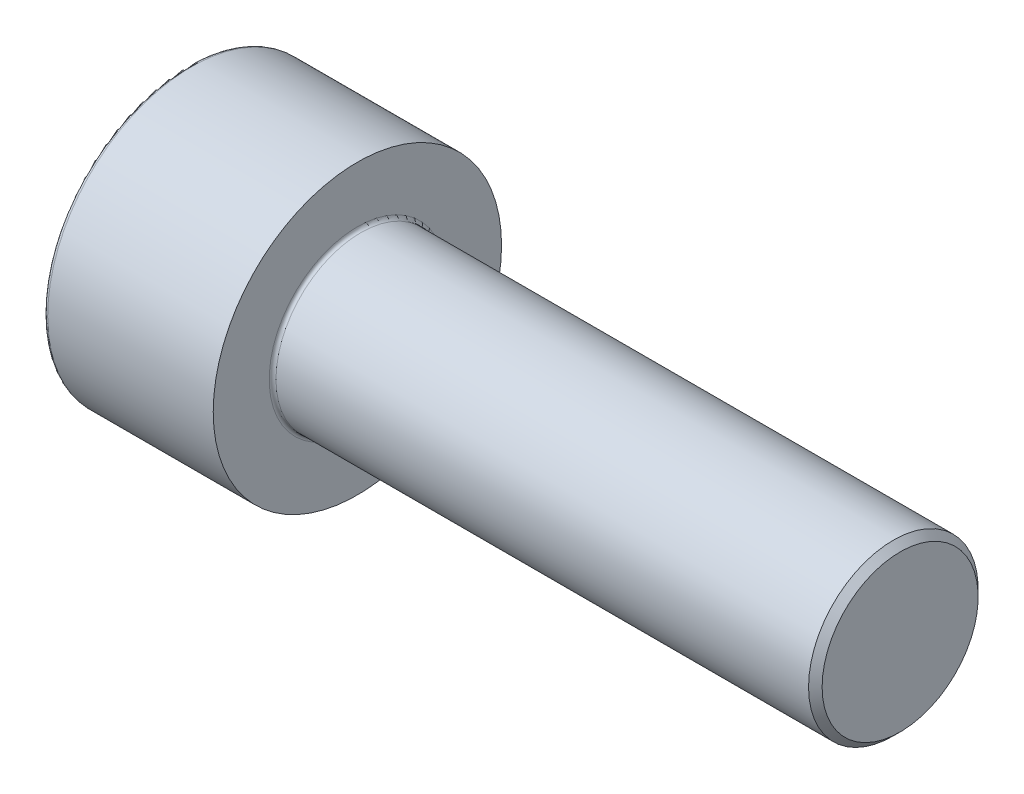
ISO-10303-21;
HEADER;
FILE_DESCRIPTION(('STEP AP214'),'2;1');
FILE_NAME('part.step','',(''),(''),'','','');
FILE_SCHEMA(('AUTOMOTIVE_DESIGN { 1 0 10303 214 1 1 1 1 }'));
ENDSEC;
DATA;
#1=APPLICATION_CONTEXT('core data for automotive mechanical design processes');
#2=APPLICATION_PROTOCOL_DEFINITION('international standard','automotive_design',2000,#1);
#3=PRODUCT_CONTEXT('',#1,'mechanical');
#4=PRODUCT('Part','Part','',(#3));
#5=PRODUCT_RELATED_PRODUCT_CATEGORY('part','',(#4));
#6=PRODUCT_DEFINITION_FORMATION('','',#4);
#7=PRODUCT_DEFINITION_CONTEXT('part definition',#1,'design');
#8=PRODUCT_DEFINITION('design','',#6,#7);
#9=PRODUCT_DEFINITION_SHAPE('','',#8);
#10=(LENGTH_UNIT() NAMED_UNIT(*) SI_UNIT(.MILLI.,.METRE.));
#11=(NAMED_UNIT(*) PLANE_ANGLE_UNIT() SI_UNIT($,.RADIAN.));
#12=(NAMED_UNIT(*) SI_UNIT($,.STERADIAN.) SOLID_ANGLE_UNIT());
#13=UNCERTAINTY_MEASURE_WITH_UNIT(LENGTH_MEASURE(1.E-05),#10,'distance_accuracy_value','');
#14=(GEOMETRIC_REPRESENTATION_CONTEXT(3) GLOBAL_UNCERTAINTY_ASSIGNED_CONTEXT((#13)) GLOBAL_UNIT_ASSIGNED_CONTEXT((#10,
#11,#12)) REPRESENTATION_CONTEXT('',''));
#15=CARTESIAN_POINT('',(0.,0.,0.));
#16=DIRECTION('',(0.,0.,1.));
#17=DIRECTION('',(1.,0.,0.));
#18=AXIS2_PLACEMENT_3D('',#15,#16,#17);
#19=CARTESIAN_POINT('',(21.,0.,0.));
#20=DIRECTION('',(-1.,0.,0.));
#21=DIRECTION('',(0.,0.,1.));
#22=AXIS2_PLACEMENT_3D('',#19,#20,#21);
#23=PLANE('',#22);
#24=CARTESIAN_POINT('',(21.,0.,0.));
#25=DIRECTION('',(-1.,0.,0.));
#26=DIRECTION('',(0.,0.,1.));
#27=AXIS2_PLACEMENT_3D('',#24,#25,#26);
#28=CIRCLE('',#27,2.3);
#29=CARTESIAN_POINT('',(21.,0.,2.3));
#30=VERTEX_POINT('',#29);
#31=EDGE_CURVE('E11',#30,#30,#28,.F.);
#32=ORIENTED_EDGE('',*,*,#31,.T.);
#33=EDGE_LOOP('',(#32));
#34=FACE_BOUND('',#33,.T.);
#35=ADVANCED_FACE('F35',(#34),#23,.F.);
#36=CARTESIAN_POINT('',(0.,0.,0.));
#37=DIRECTION('',(-1.,0.,0.));
#38=DIRECTION('',(0.,0.,1.));
#39=AXIS2_PLACEMENT_3D('',#36,#37,#38);
#40=CYLINDRICAL_SURFACE('',#39,2.5);
#41=CARTESIAN_POINT('',(20.8,0.,0.));
#42=DIRECTION('',(-1.,0.,0.));
#43=DIRECTION('',(0.,0.,1.));
#44=AXIS2_PLACEMENT_3D('',#41,#42,#43);
#45=CIRCLE('',#44,2.5);
#46=CARTESIAN_POINT('',(20.8,0.,2.5));
#47=VERTEX_POINT('',#46);
#48=EDGE_CURVE('E43',#47,#47,#45,.T.);
#49=ORIENTED_EDGE('',*,*,#48,.T.);
#50=EDGE_LOOP('',(#49));
#51=FACE_BOUND('',#50,.T.);
#52=CARTESIAN_POINT('',(5.1,0.,0.));
#53=DIRECTION('',(1.,0.,0.));
#54=DIRECTION('',(0.,0.,-1.));
#55=AXIS2_PLACEMENT_3D('',#52,#53,#54);
#56=CIRCLE('',#55,2.5);
#57=CARTESIAN_POINT('',(5.1,0.,-2.5));
#58=VERTEX_POINT('',#57);
#59=EDGE_CURVE('E148',#58,#58,#56,.T.);
#60=ORIENTED_EDGE('',*,*,#59,.T.);
#61=EDGE_LOOP('',(#60));
#62=FACE_BOUND('',#61,.T.);
#63=ADVANCED_FACE('F159',(#51,#62),#40,.T.);
#64=CARTESIAN_POINT('',(5.,0.,0.));
#65=DIRECTION('',(1.,0.,0.));
#66=DIRECTION('',(0.,0.,-1.));
#67=AXIS2_PLACEMENT_3D('',#64,#65,#66);
#68=PLANE('',#67);
#69=CARTESIAN_POINT('',(5.,0.,0.));
#70=DIRECTION('',(1.,0.,0.));
#71=DIRECTION('',(0.,0.,-1.));
#72=AXIS2_PLACEMENT_3D('',#69,#70,#71);
#73=CIRCLE('',#72,2.6);
#74=CARTESIAN_POINT('',(5.,0.,-2.6));
#75=VERTEX_POINT('',#74);
#76=EDGE_CURVE('E145',#75,#75,#73,.F.);
#77=ORIENTED_EDGE('',*,*,#76,.T.);
#78=EDGE_LOOP('',(#77));
#79=FACE_BOUND('',#78,.T.);
#80=CARTESIAN_POINT('',(5.,0.,0.));
#81=DIRECTION('',(-1.,0.,0.));
#82=DIRECTION('',(0.,0.,1.));
#83=AXIS2_PLACEMENT_3D('',#80,#81,#82);
#84=CIRCLE('',#83,4.25);
#85=CARTESIAN_POINT('',(5.,0.,4.25));
#86=VERTEX_POINT('',#85);
#87=EDGE_CURVE('E137',#86,#86,#84,.T.);
#88=ORIENTED_EDGE('',*,*,#87,.F.);
#89=EDGE_LOOP('',(#88));
#90=FACE_BOUND('',#89,.T.);
#91=ADVANCED_FACE('F181',(#79,#90),#68,.T.);
#92=CARTESIAN_POINT('',(0.,0.,0.));
#93=DIRECTION('',(-1.,0.,0.));
#94=DIRECTION('',(0.,0.,1.));
#95=AXIS2_PLACEMENT_3D('',#92,#93,#94);
#96=CYLINDRICAL_SURFACE('',#95,4.25);
#97=CARTESIAN_POINT('',(0.12,0.,0.));
#98=DIRECTION('',(-1.,0.,0.));
#99=DIRECTION('',(0.,0.,1.));
#100=AXIS2_PLACEMENT_3D('',#97,#98,#99);
#101=CIRCLE('',#100,4.25);
#102=CARTESIAN_POINT('',(0.12,0.,4.25));
#103=VERTEX_POINT('',#102);
#104=EDGE_CURVE('E154',#103,#103,#101,.F.);
#105=ORIENTED_EDGE('',*,*,#104,.T.);
#106=EDGE_LOOP('',(#105));
#107=FACE_BOUND('',#106,.T.);
#108=ORIENTED_EDGE('',*,*,#87,.T.);
#109=EDGE_LOOP('',(#108));
#110=FACE_BOUND('',#109,.T.);
#111=ADVANCED_FACE('F191',(#107,#110),#96,.T.);
#112=CARTESIAN_POINT('',(0.,0.,0.));
#113=DIRECTION('',(-1.,0.,0.));
#114=DIRECTION('',(0.,0.,1.));
#115=AXIS2_PLACEMENT_3D('',#112,#113,#114);
#116=PLANE('',#115);
#117=DIRECTION('',(0.,0.5,-0.866025403784439));
#118=VECTOR('',#117,1.);
#119=CARTESIAN_POINT('',(0.,1.15470053837925,2.));
#120=LINE('',#119,#118);
#121=CARTESIAN_POINT('',(0.,1.15470053837925,2.));
#122=VERTEX_POINT('',#121);
#123=CARTESIAN_POINT('',(0.,2.3094010767585,0.));
#124=VERTEX_POINT('',#123);
#125=EDGE_CURVE('E50',#122,#124,#120,.T.);
#126=ORIENTED_EDGE('',*,*,#125,.F.);
#127=DIRECTION('',(0.,1.,0.));
#128=VECTOR('',#127,1.);
#129=CARTESIAN_POINT('',(0.,-1.15470053837925,2.));
#130=LINE('',#129,#128);
#131=CARTESIAN_POINT('',(0.,-1.15470053837925,2.));
#132=VERTEX_POINT('',#131);
#133=EDGE_CURVE('E133',#132,#122,#130,.T.);
#134=ORIENTED_EDGE('',*,*,#133,.F.);
#135=DIRECTION('',(0.,0.5,0.866025403784439));
#136=VECTOR('',#135,1.);
#137=CARTESIAN_POINT('',(0.,-2.3094010767585,0.));
#138=LINE('',#137,#136);
#139=CARTESIAN_POINT('',(0.,-2.3094010767585,0.));
#140=VERTEX_POINT('',#139);
#141=EDGE_CURVE('E131',#140,#132,#138,.T.);
#142=ORIENTED_EDGE('',*,*,#141,.F.);
#143=DIRECTION('',(0.,-0.5,0.866025403784439));
#144=VECTOR('',#143,1.);
#145=CARTESIAN_POINT('',(0.,-1.15470053837925,-2.));
#146=LINE('',#145,#144);
#147=CARTESIAN_POINT('',(0.,-1.15470053837925,-2.));
#148=VERTEX_POINT('',#147);
#149=EDGE_CURVE('E98',#148,#140,#146,.T.);
#150=ORIENTED_EDGE('',*,*,#149,.F.);
#151=DIRECTION('',(0.,-1.,0.));
#152=VECTOR('',#151,1.);
#153=CARTESIAN_POINT('',(0.,1.15470053837925,-2.));
#154=LINE('',#153,#152);
#155=CARTESIAN_POINT('',(0.,1.15470053837925,-2.));
#156=VERTEX_POINT('',#155);
#157=EDGE_CURVE('E127',#156,#148,#154,.T.);
#158=ORIENTED_EDGE('',*,*,#157,.F.);
#159=DIRECTION('',(0.,-0.5,-0.866025403784439));
#160=VECTOR('',#159,1.);
#161=CARTESIAN_POINT('',(0.,2.3094010767585,0.));
#162=LINE('',#161,#160);
#163=EDGE_CURVE('E124',#124,#156,#162,.T.);
#164=ORIENTED_EDGE('',*,*,#163,.F.);
#165=EDGE_LOOP('',(#126,#134,#142,#150,#158,#164));
#166=FACE_BOUND('',#165,.T.);
#167=CARTESIAN_POINT('',(0.,0.,0.));
#168=DIRECTION('',(-1.,0.,0.));
#169=DIRECTION('',(0.,0.,1.));
#170=AXIS2_PLACEMENT_3D('',#167,#168,#169);
#171=CIRCLE('',#170,4.13);
#172=CARTESIAN_POINT('',(0.,0.,4.13));
#173=VERTEX_POINT('',#172);
#174=EDGE_CURVE('E151',#173,#173,#171,.T.);
#175=ORIENTED_EDGE('',*,*,#174,.T.);
#176=EDGE_LOOP('',(#175));
#177=FACE_BOUND('',#176,.T.);
#178=ADVANCED_FACE('F186',(#166,#177),#116,.T.);
#179=CARTESIAN_POINT('',(5.1,0.,0.));
#180=DIRECTION('',(1.,0.,0.));
#181=DIRECTION('',(0.,0.,-1.));
#182=AXIS2_PLACEMENT_3D('',#179,#180,#181);
#183=TOROIDAL_SURFACE('',#182,2.6,0.1);
#184=ORIENTED_EDGE('',*,*,#59,.F.);
#185=EDGE_LOOP('',(#184));
#186=FACE_BOUND('',#185,.T.);
#187=ORIENTED_EDGE('',*,*,#76,.F.);
#188=EDGE_LOOP('',(#187));
#189=FACE_BOUND('',#188,.T.);
#190=ADVANCED_FACE('F172',(#186,#189),#183,.F.);
#191=CARTESIAN_POINT('',(0.12,0.,0.));
#192=DIRECTION('',(-1.,0.,0.));
#193=DIRECTION('',(0.,0.,1.));
#194=AXIS2_PLACEMENT_3D('',#191,#192,#193);
#195=TOROIDAL_SURFACE('',#194,4.13,0.12);
#196=ORIENTED_EDGE('',*,*,#104,.F.);
#197=EDGE_LOOP('',(#196));
#198=FACE_BOUND('',#197,.T.);
#199=ORIENTED_EDGE('',*,*,#174,.F.);
#200=EDGE_LOOP('',(#199));
#201=FACE_BOUND('',#200,.T.);
#202=ADVANCED_FACE('F164',(#198,#201),#195,.T.);
#203=CARTESIAN_POINT('',(20.8,0.,0.));
#204=DIRECTION('',(-1.,0.,0.));
#205=DIRECTION('',(0.,0.,1.));
#206=AXIS2_PLACEMENT_3D('',#203,#204,#205);
#207=CONICAL_SURFACE('',#206,2.5,0.785398163397446);
#208=ORIENTED_EDGE('',*,*,#31,.F.);
#209=EDGE_LOOP('',(#208));
#210=FACE_BOUND('',#209,.T.);
#211=ORIENTED_EDGE('',*,*,#48,.F.);
#212=EDGE_LOOP('',(#211));
#213=FACE_BOUND('',#212,.T.);
#214=ADVANCED_FACE('F37',(#210,#213),#207,.T.);
#215=CARTESIAN_POINT('',(3.5,1.15470053837925,2.));
#216=DIRECTION('',(0.,0.866025403784439,0.5));
#217=DIRECTION('',(0.,-0.5,0.866025403784439));
#218=AXIS2_PLACEMENT_3D('',#215,#216,#217);
#219=PLANE('',#218);
#220=ORIENTED_EDGE('',*,*,#125,.T.);
#221=DIRECTION('',(-1.,0.,0.));
#222=VECTOR('',#221,1.);
#223=CARTESIAN_POINT('',(3.5,2.3094010767585,0.));
#224=LINE('',#223,#222);
#225=CARTESIAN_POINT('',(3.5,2.3094010767585,0.));
#226=VERTEX_POINT('',#225);
#227=EDGE_CURVE('E80',#226,#124,#224,.T.);
#228=ORIENTED_EDGE('',*,*,#227,.F.);
#229=DIRECTION('',(0.,0.5,-0.866025403784439));
#230=VECTOR('',#229,1.);
#231=CARTESIAN_POINT('',(3.5,1.15470053837925,2.));
#232=LINE('',#231,#230);
#233=CARTESIAN_POINT('',(3.5,1.15470053837925,2.));
#234=VERTEX_POINT('',#233);
#235=EDGE_CURVE('E135',#234,#226,#232,.T.);
#236=ORIENTED_EDGE('',*,*,#235,.F.);
#237=DIRECTION('',(-1.,0.,0.));
#238=VECTOR('',#237,1.);
#239=CARTESIAN_POINT('',(3.5,1.15470053837925,2.));
#240=LINE('',#239,#238);
#241=EDGE_CURVE('E58',#234,#122,#240,.T.);
#242=ORIENTED_EDGE('',*,*,#241,.T.);
#243=EDGE_LOOP('',(#220,#228,#236,#242));
#244=FACE_BOUND('',#243,.T.);
#245=ADVANCED_FACE('F163',(#244),#219,.F.);
#246=CARTESIAN_POINT('',(3.5,-1.15470053837925,2.));
#247=DIRECTION('',(0.,0.,1.));
#248=DIRECTION('',(0.,-1.,0.));
#249=AXIS2_PLACEMENT_3D('',#246,#247,#248);
#250=PLANE('',#249);
#251=ORIENTED_EDGE('',*,*,#133,.T.);
#252=ORIENTED_EDGE('',*,*,#241,.F.);
#253=DIRECTION('',(0.,1.,0.));
#254=VECTOR('',#253,1.);
#255=CARTESIAN_POINT('',(3.5,-1.15470053837925,2.));
#256=LINE('',#255,#254);
#257=CARTESIAN_POINT('',(3.5,-1.15470053837925,2.));
#258=VERTEX_POINT('',#257);
#259=EDGE_CURVE('E110',#258,#234,#256,.T.);
#260=ORIENTED_EDGE('',*,*,#259,.F.);
#261=DIRECTION('',(-1.,0.,0.));
#262=VECTOR('',#261,1.);
#263=CARTESIAN_POINT('',(3.5,-1.15470053837925,2.));
#264=LINE('',#263,#262);
#265=EDGE_CURVE('E102',#258,#132,#264,.T.);
#266=ORIENTED_EDGE('',*,*,#265,.T.);
#267=EDGE_LOOP('',(#251,#252,#260,#266));
#268=FACE_BOUND('',#267,.T.);
#269=ADVANCED_FACE('F170',(#268),#250,.F.);
#270=CARTESIAN_POINT('',(3.5,-2.3094010767585,0.));
#271=DIRECTION('',(0.,-0.866025403784439,0.5));
#272=DIRECTION('',(0.,-0.5,-0.866025403784439));
#273=AXIS2_PLACEMENT_3D('',#270,#271,#272);
#274=PLANE('',#273);
#275=ORIENTED_EDGE('',*,*,#141,.T.);
#276=ORIENTED_EDGE('',*,*,#265,.F.);
#277=DIRECTION('',(0.,0.5,0.866025403784439));
#278=VECTOR('',#277,1.);
#279=CARTESIAN_POINT('',(3.5,-2.3094010767585,0.));
#280=LINE('',#279,#278);
#281=CARTESIAN_POINT('',(3.5,-2.3094010767585,0.));
#282=VERTEX_POINT('',#281);
#283=EDGE_CURVE('E106',#282,#258,#280,.T.);
#284=ORIENTED_EDGE('',*,*,#283,.F.);
#285=DIRECTION('',(-1.,0.,0.));
#286=VECTOR('',#285,1.);
#287=CARTESIAN_POINT('',(3.5,-2.3094010767585,0.));
#288=LINE('',#287,#286);
#289=EDGE_CURVE('E91',#282,#140,#288,.T.);
#290=ORIENTED_EDGE('',*,*,#289,.T.);
#291=EDGE_LOOP('',(#275,#276,#284,#290));
#292=FACE_BOUND('',#291,.T.);
#293=ADVANCED_FACE('F107',(#292),#274,.F.);
#294=CARTESIAN_POINT('',(3.5,-1.15470053837925,-2.));
#295=DIRECTION('',(0.,-0.866025403784439,-0.5));
#296=DIRECTION('',(0.,0.5,-0.866025403784439));
#297=AXIS2_PLACEMENT_3D('',#294,#295,#296);
#298=PLANE('',#297);
#299=ORIENTED_EDGE('',*,*,#149,.T.);
#300=ORIENTED_EDGE('',*,*,#289,.F.);
#301=DIRECTION('',(0.,-0.5,0.866025403784439));
#302=VECTOR('',#301,1.);
#303=CARTESIAN_POINT('',(3.5,-1.15470053837925,-2.));
#304=LINE('',#303,#302);
#305=CARTESIAN_POINT('',(3.5,-1.15470053837925,-2.));
#306=VERTEX_POINT('',#305);
#307=EDGE_CURVE('E95',#306,#282,#304,.T.);
#308=ORIENTED_EDGE('',*,*,#307,.F.);
#309=DIRECTION('',(-1.,0.,0.));
#310=VECTOR('',#309,1.);
#311=CARTESIAN_POINT('',(3.5,-1.15470053837925,-2.));
#312=LINE('',#311,#310);
#313=EDGE_CURVE('E103',#306,#148,#312,.T.);
#314=ORIENTED_EDGE('',*,*,#313,.T.);
#315=EDGE_LOOP('',(#299,#300,#308,#314));
#316=FACE_BOUND('',#315,.T.);
#317=ADVANCED_FACE('F93',(#316),#298,.F.);
#318=CARTESIAN_POINT('',(3.5,1.15470053837925,-2.));
#319=DIRECTION('',(0.,0.,-1.));
#320=DIRECTION('',(0.,1.,0.));
#321=AXIS2_PLACEMENT_3D('',#318,#319,#320);
#322=PLANE('',#321);
#323=ORIENTED_EDGE('',*,*,#157,.T.);
#324=ORIENTED_EDGE('',*,*,#313,.F.);
#325=DIRECTION('',(0.,-1.,0.));
#326=VECTOR('',#325,1.);
#327=CARTESIAN_POINT('',(3.5,1.15470053837925,-2.));
#328=LINE('',#327,#326);
#329=CARTESIAN_POINT('',(3.5,1.15470053837925,-2.));
#330=VERTEX_POINT('',#329);
#331=EDGE_CURVE('E116',#330,#306,#328,.T.);
#332=ORIENTED_EDGE('',*,*,#331,.F.);
#333=DIRECTION('',(-1.,0.,0.));
#334=VECTOR('',#333,1.);
#335=CARTESIAN_POINT('',(3.5,1.15470053837925,-2.));
#336=LINE('',#335,#334);
#337=EDGE_CURVE('E140',#330,#156,#336,.T.);
#338=ORIENTED_EDGE('',*,*,#337,.T.);
#339=EDGE_LOOP('',(#323,#324,#332,#338));
#340=FACE_BOUND('',#339,.T.);
#341=ADVANCED_FACE('F211',(#340),#322,.F.);
#342=CARTESIAN_POINT('',(3.5,2.3094010767585,0.));
#343=DIRECTION('',(0.,0.866025403784438,-0.5));
#344=DIRECTION('',(0.,0.5,0.866025403784439));
#345=AXIS2_PLACEMENT_3D('',#342,#343,#344);
#346=PLANE('',#345);
#347=ORIENTED_EDGE('',*,*,#163,.T.);
#348=ORIENTED_EDGE('',*,*,#337,.F.);
#349=DIRECTION('',(0.,-0.5,-0.866025403784439));
#350=VECTOR('',#349,1.);
#351=CARTESIAN_POINT('',(3.5,2.3094010767585,0.));
#352=LINE('',#351,#350);
#353=EDGE_CURVE('E118',#226,#330,#352,.T.);
#354=ORIENTED_EDGE('',*,*,#353,.F.);
#355=ORIENTED_EDGE('',*,*,#227,.T.);
#356=EDGE_LOOP('',(#347,#348,#354,#355));
#357=FACE_BOUND('',#356,.T.);
#358=ADVANCED_FACE('F208',(#357),#346,.F.);
#359=CARTESIAN_POINT('',(3.5,0.,0.));
#360=DIRECTION('',(-1.,0.,0.));
#361=DIRECTION('',(0.,0.,1.));
#362=AXIS2_PLACEMENT_3D('',#359,#360,#361);
#363=PLANE('',#362);
#364=ORIENTED_EDGE('',*,*,#235,.T.);
#365=ORIENTED_EDGE('',*,*,#353,.T.);
#366=ORIENTED_EDGE('',*,*,#331,.T.);
#367=ORIENTED_EDGE('',*,*,#307,.T.);
#368=ORIENTED_EDGE('',*,*,#283,.T.);
#369=ORIENTED_EDGE('',*,*,#259,.T.);
#370=EDGE_LOOP('',(#364,#365,#366,#367,#368,#369));
#371=FACE_BOUND('',#370,.T.);
#372=ADVANCED_FACE('F113',(#371),#363,.T.);
#373=CLOSED_SHELL('',(#35,#63,#91,#111,#178,#190,#202,#214,#245,#269,#293,#317,#341,#358,#372));
#374=MANIFOLD_SOLID_BREP('B2',#373);
#375=ADVANCED_BREP_SHAPE_REPRESENTATION('',(#18,#374),#14);
#376=SHAPE_DEFINITION_REPRESENTATION(#9,#375);
ENDSEC;
END-ISO-10303-21;
